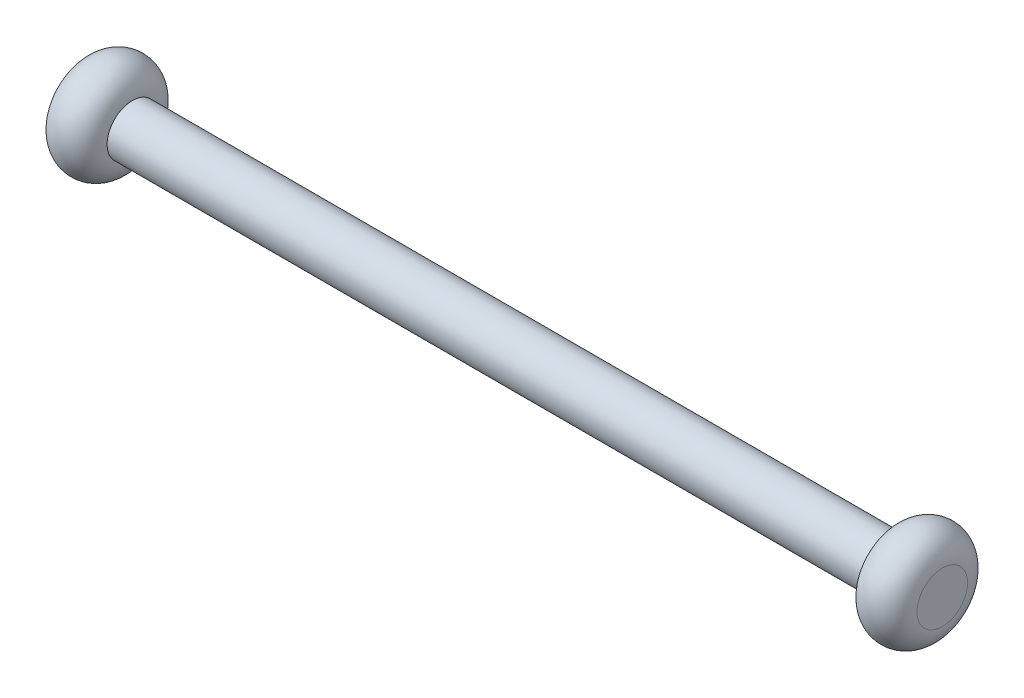
ISO-10303-21;
HEADER;
FILE_DESCRIPTION(('STEP AP214'),'2;1');
FILE_NAME('part.step','',(''),(''),'','','');
FILE_SCHEMA(('AUTOMOTIVE_DESIGN { 1 0 10303 214 1 1 1 1 }'));
ENDSEC;
DATA;
#1=APPLICATION_CONTEXT('core data for automotive mechanical design processes');
#2=APPLICATION_PROTOCOL_DEFINITION('international standard','automotive_design',2000,#1);
#3=PRODUCT_CONTEXT('',#1,'mechanical');
#4=PRODUCT('Part','Part','',(#3));
#5=PRODUCT_RELATED_PRODUCT_CATEGORY('part','',(#4));
#6=PRODUCT_DEFINITION_FORMATION('','',#4);
#7=PRODUCT_DEFINITION_CONTEXT('part definition',#1,'design');
#8=PRODUCT_DEFINITION('design','',#6,#7);
#9=PRODUCT_DEFINITION_SHAPE('','',#8);
#10=(LENGTH_UNIT() NAMED_UNIT(*) SI_UNIT(.MILLI.,.METRE.));
#11=(NAMED_UNIT(*) PLANE_ANGLE_UNIT() SI_UNIT($,.RADIAN.));
#12=(NAMED_UNIT(*) SI_UNIT($,.STERADIAN.) SOLID_ANGLE_UNIT());
#13=UNCERTAINTY_MEASURE_WITH_UNIT(LENGTH_MEASURE(1.E-05),#10,'distance_accuracy_value','');
#14=(GEOMETRIC_REPRESENTATION_CONTEXT(3) GLOBAL_UNCERTAINTY_ASSIGNED_CONTEXT((#13)) GLOBAL_UNIT_ASSIGNED_CONTEXT((#10,
#11,#12)) REPRESENTATION_CONTEXT('',''));
#15=CARTESIAN_POINT('',(0.,0.,0.));
#16=DIRECTION('',(0.,0.,1.));
#17=DIRECTION('',(1.,0.,0.));
#18=AXIS2_PLACEMENT_3D('',#15,#16,#17);
#19=CARTESIAN_POINT('',(85.,0.,0.));
#20=DIRECTION('',(-1.,0.,0.));
#21=DIRECTION('',(0.,0.,1.));
#22=AXIS2_PLACEMENT_3D('',#19,#20,#21);
#23=PLANE('',#22);
#24=CARTESIAN_POINT('',(85.,0.,0.));
#25=DIRECTION('',(-1.,0.,0.));
#26=DIRECTION('',(0.,0.,1.));
#27=AXIS2_PLACEMENT_3D('',#24,#25,#26);
#28=CIRCLE('',#27,5.);
#29=CARTESIAN_POINT('',(85.,0.,5.));
#30=VERTEX_POINT('',#29);
#31=EDGE_CURVE('E44',#30,#30,#28,.T.);
#32=ORIENTED_EDGE('',*,*,#31,.F.);
#33=EDGE_LOOP('',(#32));
#34=FACE_BOUND('',#33,.T.);
#35=ADVANCED_FACE('F30',(#34),#23,.F.);
#36=CARTESIAN_POINT('',(-85.,0.,0.));
#37=DIRECTION('',(1.,0.,0.));
#38=DIRECTION('',(0.,0.,-1.));
#39=AXIS2_PLACEMENT_3D('',#36,#37,#38);
#40=PLANE('',#39);
#41=CARTESIAN_POINT('',(-85.,0.,0.));
#42=DIRECTION('',(-1.,0.,0.));
#43=DIRECTION('',(0.,0.,1.));
#44=AXIS2_PLACEMENT_3D('',#41,#42,#43);
#45=CIRCLE('',#44,5.);
#46=CARTESIAN_POINT('',(-85.,0.,5.));
#47=VERTEX_POINT('',#46);
#48=EDGE_CURVE('E10',#47,#47,#45,.T.);
#49=ORIENTED_EDGE('',*,*,#48,.T.);
#50=EDGE_LOOP('',(#49));
#51=FACE_BOUND('',#50,.T.);
#52=ADVANCED_FACE('F53',(#51),#40,.F.);
#53=CARTESIAN_POINT('',(-80.,0.,0.));
#54=DIRECTION('',(-1.,0.,0.));
#55=DIRECTION('',(0.,0.,1.));
#56=AXIS2_PLACEMENT_3D('',#53,#54,#55);
#57=DEGENERATE_TOROIDAL_SURFACE('',#56,5.,5.,.T.);
#58=ORIENTED_EDGE('',*,*,#48,.F.);
#59=EDGE_LOOP('',(#58));
#60=FACE_BOUND('',#59,.T.);
#61=CARTESIAN_POINT('',(-75.,0.,0.));
#62=DIRECTION('',(-1.,0.,0.));
#63=DIRECTION('',(0.,0.,1.));
#64=AXIS2_PLACEMENT_3D('',#61,#62,#63);
#65=CIRCLE('',#64,5.);
#66=CARTESIAN_POINT('',(-75.,0.,5.));
#67=VERTEX_POINT('',#66);
#68=EDGE_CURVE('E36',#67,#67,#65,.T.);
#69=ORIENTED_EDGE('',*,*,#68,.T.);
#70=EDGE_LOOP('',(#69));
#71=FACE_BOUND('',#70,.T.);
#72=ADVANCED_FACE('F57',(#60,#71),#57,.T.);
#73=CARTESIAN_POINT('',(-85.,0.,0.));
#74=DIRECTION('',(-1.,0.,0.));
#75=DIRECTION('',(0.,0.,1.));
#76=AXIS2_PLACEMENT_3D('',#73,#74,#75);
#77=CYLINDRICAL_SURFACE('',#76,5.);
#78=ORIENTED_EDGE('',*,*,#68,.F.);
#79=EDGE_LOOP('',(#78));
#80=FACE_BOUND('',#79,.T.);
#81=CARTESIAN_POINT('',(75.,0.,0.));
#82=DIRECTION('',(-1.,0.,0.));
#83=DIRECTION('',(0.,0.,1.));
#84=AXIS2_PLACEMENT_3D('',#81,#82,#83);
#85=CIRCLE('',#84,5.);
#86=CARTESIAN_POINT('',(75.,0.,5.));
#87=VERTEX_POINT('',#86);
#88=EDGE_CURVE('E40',#87,#87,#85,.T.);
#89=ORIENTED_EDGE('',*,*,#88,.T.);
#90=EDGE_LOOP('',(#89));
#91=FACE_BOUND('',#90,.T.);
#92=ADVANCED_FACE('F61',(#80,#91),#77,.T.);
#93=CARTESIAN_POINT('',(80.,0.,0.));
#94=DIRECTION('',(-1.,0.,0.));
#95=DIRECTION('',(0.,0.,1.));
#96=AXIS2_PLACEMENT_3D('',#93,#94,#95);
#97=DEGENERATE_TOROIDAL_SURFACE('',#96,5.,5.,.T.);
#98=ORIENTED_EDGE('',*,*,#88,.F.);
#99=EDGE_LOOP('',(#98));
#100=FACE_BOUND('',#99,.T.);
#101=ORIENTED_EDGE('',*,*,#31,.T.);
#102=EDGE_LOOP('',(#101));
#103=FACE_BOUND('',#102,.T.);
#104=ADVANCED_FACE('F50',(#100,#103),#97,.T.);
#105=CLOSED_SHELL('',(#35,#52,#72,#92,#104));
#106=MANIFOLD_SOLID_BREP('B2',#105);
#107=ADVANCED_BREP_SHAPE_REPRESENTATION('',(#18,#106),#14);
#108=SHAPE_DEFINITION_REPRESENTATION(#9,#107);
ENDSEC;
END-ISO-10303-21;
